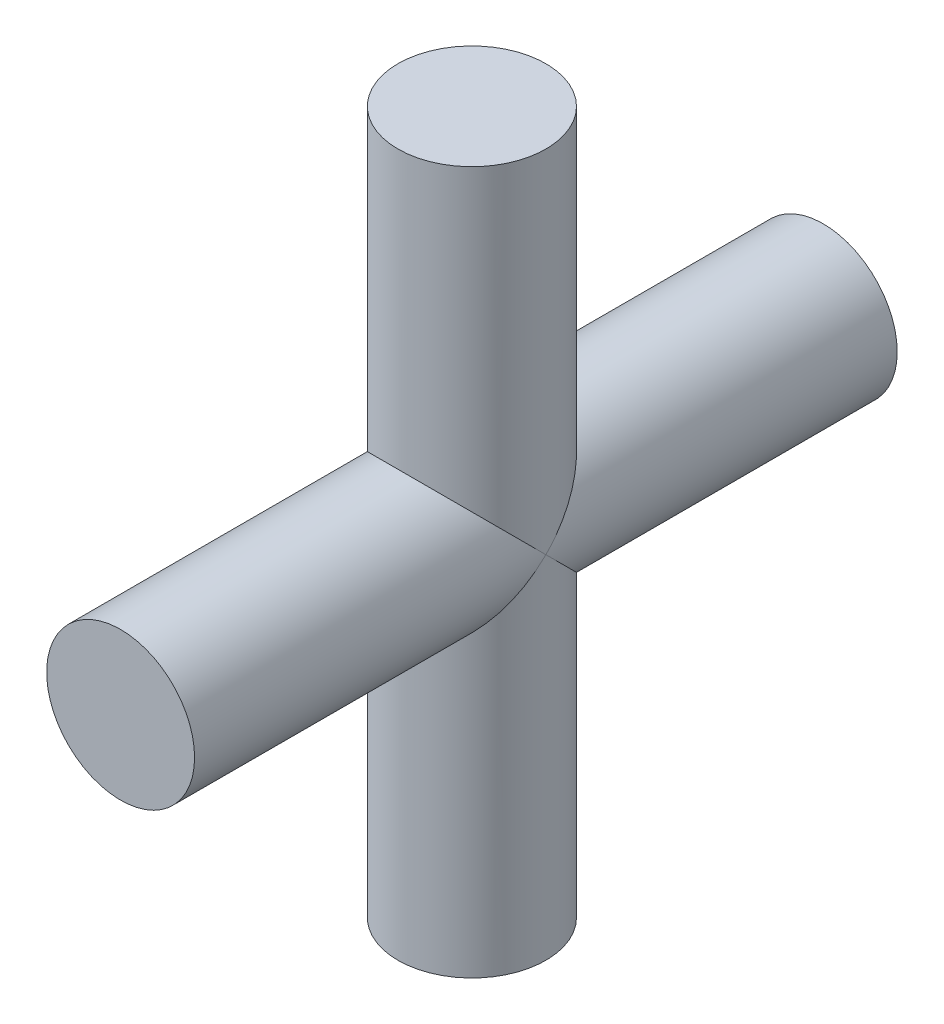
ISO-10303-21;
HEADER;
FILE_DESCRIPTION(('STEP AP214'),'2;1');
FILE_NAME('part.step','',(''),(''),'','','');
FILE_SCHEMA(('AUTOMOTIVE_DESIGN { 1 0 10303 214 1 1 1 1 }'));
ENDSEC;
DATA;
#1=APPLICATION_CONTEXT('core data for automotive mechanical design processes');
#2=APPLICATION_PROTOCOL_DEFINITION('international standard','automotive_design',2000,#1);
#3=PRODUCT_CONTEXT('',#1,'mechanical');
#4=PRODUCT('Part','Part','',(#3));
#5=PRODUCT_RELATED_PRODUCT_CATEGORY('part','',(#4));
#6=PRODUCT_DEFINITION_FORMATION('','',#4);
#7=PRODUCT_DEFINITION_CONTEXT('part definition',#1,'design');
#8=PRODUCT_DEFINITION('design','',#6,#7);
#9=PRODUCT_DEFINITION_SHAPE('','',#8);
#10=(LENGTH_UNIT() NAMED_UNIT(*) SI_UNIT(.MILLI.,.METRE.));
#11=(NAMED_UNIT(*) PLANE_ANGLE_UNIT() SI_UNIT($,.RADIAN.));
#12=(NAMED_UNIT(*) SI_UNIT($,.STERADIAN.) SOLID_ANGLE_UNIT());
#13=UNCERTAINTY_MEASURE_WITH_UNIT(LENGTH_MEASURE(1.E-05),#10,'distance_accuracy_value','');
#14=(GEOMETRIC_REPRESENTATION_CONTEXT(3) GLOBAL_UNCERTAINTY_ASSIGNED_CONTEXT((#13)) GLOBAL_UNIT_ASSIGNED_CONTEXT((#10,
#11,#12)) REPRESENTATION_CONTEXT('',''));
#15=CARTESIAN_POINT('',(0.,0.,0.));
#16=DIRECTION('',(0.,0.,1.));
#17=DIRECTION('',(1.,0.,0.));
#18=AXIS2_PLACEMENT_3D('',#15,#16,#17);
#19=CARTESIAN_POINT('',(0.,19.,0.));
#20=DIRECTION('',(0.,-1.,0.));
#21=DIRECTION('',(0.,0.,-1.));
#22=AXIS2_PLACEMENT_3D('',#19,#20,#21);
#23=CYLINDRICAL_SURFACE('',#22,2.);
#24=CARTESIAN_POINT('',(0.,9.5,0.));
#25=DIRECTION('',(0.,-0.707106781186547,-0.707106781186547));
#26=DIRECTION('',(0.,-0.707106781186547,0.707106781186547));
#27=AXIS2_PLACEMENT_3D('',#24,#25,#26);
#28=ELLIPSE('',#27,2.82842712474619,2.);
#29=CARTESIAN_POINT('',(2.,9.5,0.));
#30=VERTEX_POINT('',#29);
#31=CARTESIAN_POINT('',(-2.,9.5,0.));
#32=VERTEX_POINT('',#31);
#33=EDGE_CURVE('E58',#30,#32,#28,.T.);
#34=ORIENTED_EDGE('',*,*,#33,.T.);
#35=CARTESIAN_POINT('',(0.,9.5,0.));
#36=DIRECTION('',(0.,-0.707106781186547,0.707106781186547));
#37=DIRECTION('',(0.,-0.707106781186547,-0.707106781186547));
#38=AXIS2_PLACEMENT_3D('',#35,#36,#37);
#39=ELLIPSE('',#38,2.82842712474619,2.);
#40=EDGE_CURVE('E47',#32,#30,#39,.T.);
#41=ORIENTED_EDGE('',*,*,#40,.T.);
#42=EDGE_LOOP('',(#34,#41));
#43=FACE_BOUND('',#42,.T.);
#44=CARTESIAN_POINT('',(0.,0.,0.));
#45=DIRECTION('',(0.,1.,0.));
#46=DIRECTION('',(0.,0.,1.));
#47=AXIS2_PLACEMENT_3D('',#44,#45,#46);
#48=CIRCLE('',#47,2.);
#49=CARTESIAN_POINT('',(0.,0.,2.));
#50=VERTEX_POINT('',#49);
#51=EDGE_CURVE('E73',#50,#50,#48,.T.);
#52=ORIENTED_EDGE('',*,*,#51,.T.);
#53=EDGE_LOOP('',(#52));
#54=FACE_BOUND('',#53,.T.);
#55=ADVANCED_FACE('F39',(#43,#54),#23,.T.);
#56=CARTESIAN_POINT('',(0.,0.,0.));
#57=DIRECTION('',(0.,1.,0.));
#58=DIRECTION('',(0.,0.,1.));
#59=AXIS2_PLACEMENT_3D('',#56,#57,#58);
#60=PLANE('',#59);
#61=ORIENTED_EDGE('',*,*,#51,.F.);
#62=EDGE_LOOP('',(#61));
#63=FACE_BOUND('',#62,.T.);
#64=ADVANCED_FACE('F104',(#63),#60,.F.);
#65=CARTESIAN_POINT('',(0.,9.5,-9.5));
#66=DIRECTION('',(0.,0.,1.));
#67=DIRECTION('',(1.,0.,0.));
#68=AXIS2_PLACEMENT_3D('',#65,#66,#67);
#69=PLANE('',#68);
#70=CARTESIAN_POINT('',(0.,9.5,-9.5));
#71=DIRECTION('',(0.,0.,1.));
#72=DIRECTION('',(1.,0.,0.));
#73=AXIS2_PLACEMENT_3D('',#70,#71,#72);
#74=CIRCLE('',#73,2.);
#75=CARTESIAN_POINT('',(2.,9.5,-9.5));
#76=VERTEX_POINT('',#75);
#77=EDGE_CURVE('E77',#76,#76,#74,.T.);
#78=ORIENTED_EDGE('',*,*,#77,.F.);
#79=EDGE_LOOP('',(#78));
#80=FACE_BOUND('',#79,.T.);
#81=ADVANCED_FACE('F99',(#80),#69,.F.);
#82=CARTESIAN_POINT('',(0.,9.5,-9.5));
#83=DIRECTION('',(0.,0.,1.));
#84=DIRECTION('',(1.,0.,0.));
#85=AXIS2_PLACEMENT_3D('',#82,#83,#84);
#86=CYLINDRICAL_SURFACE('',#85,2.);
#87=ORIENTED_EDGE('',*,*,#77,.T.);
#88=EDGE_LOOP('',(#87));
#89=FACE_BOUND('',#88,.T.);
#90=ORIENTED_EDGE('',*,*,#40,.F.);
#91=CARTESIAN_POINT('',(0.,9.5,0.));
#92=DIRECTION('',(0.,-0.707106781186547,-0.707106781186547));
#93=DIRECTION('',(0.,-0.707106781186547,0.707106781186547));
#94=AXIS2_PLACEMENT_3D('',#91,#92,#93);
#95=ELLIPSE('',#94,2.82842712474619,2.);
#96=EDGE_CURVE('E52',#30,#32,#95,.F.);
#97=ORIENTED_EDGE('',*,*,#96,.F.);
#98=EDGE_LOOP('',(#90,#97));
#99=FACE_BOUND('',#98,.T.);
#100=ADVANCED_FACE('F65',(#89,#99),#86,.T.);
#101=CARTESIAN_POINT('',(0.,9.5,9.5));
#102=DIRECTION('',(0.,0.,1.));
#103=DIRECTION('',(1.,0.,0.));
#104=AXIS2_PLACEMENT_3D('',#101,#102,#103);
#105=CIRCLE('',#104,2.);
#106=CARTESIAN_POINT('',(2.,9.5,9.5));
#107=VERTEX_POINT('',#106);
#108=EDGE_CURVE('E84',#107,#107,#105,.T.);
#109=ORIENTED_EDGE('',*,*,#108,.F.);
#110=EDGE_LOOP('',(#109));
#111=FACE_BOUND('',#110,.T.);
#112=CARTESIAN_POINT('',(0.,9.5,0.));
#113=DIRECTION('',(0.,-0.707106781186547,0.707106781186547));
#114=DIRECTION('',(0.,-0.707106781186547,-0.707106781186547));
#115=AXIS2_PLACEMENT_3D('',#112,#113,#114);
#116=ELLIPSE('',#115,2.82842712474619,2.);
#117=EDGE_CURVE('E11',#32,#30,#116,.F.);
#118=ORIENTED_EDGE('',*,*,#117,.F.);
#119=ORIENTED_EDGE('',*,*,#33,.F.);
#120=EDGE_LOOP('',(#118,#119));
#121=FACE_BOUND('',#120,.T.);
#122=ADVANCED_FACE('F59',(#111,#121),#86,.T.);
#123=CARTESIAN_POINT('',(0.,9.5,9.5));
#124=DIRECTION('',(0.,0.,1.));
#125=DIRECTION('',(1.,0.,0.));
#126=AXIS2_PLACEMENT_3D('',#123,#124,#125);
#127=PLANE('',#126);
#128=ORIENTED_EDGE('',*,*,#108,.T.);
#129=EDGE_LOOP('',(#128));
#130=FACE_BOUND('',#129,.T.);
#131=ADVANCED_FACE('F89',(#130),#127,.T.);
#132=CARTESIAN_POINT('',(0.,19.,0.));
#133=DIRECTION('',(0.,1.,0.));
#134=DIRECTION('',(0.,0.,1.));
#135=AXIS2_PLACEMENT_3D('',#132,#133,#134);
#136=PLANE('',#135);
#137=CARTESIAN_POINT('',(0.,19.,0.));
#138=DIRECTION('',(0.,1.,0.));
#139=DIRECTION('',(0.,0.,1.));
#140=AXIS2_PLACEMENT_3D('',#137,#138,#139);
#141=CIRCLE('',#140,2.);
#142=CARTESIAN_POINT('',(0.,19.,2.));
#143=VERTEX_POINT('',#142);
#144=EDGE_CURVE('E67',#143,#143,#141,.T.);
#145=ORIENTED_EDGE('',*,*,#144,.T.);
#146=EDGE_LOOP('',(#145));
#147=FACE_BOUND('',#146,.T.);
#148=ADVANCED_FACE('F97',(#147),#136,.T.);
#149=ORIENTED_EDGE('',*,*,#144,.F.);
#150=EDGE_LOOP('',(#149));
#151=FACE_BOUND('',#150,.T.);
#152=ORIENTED_EDGE('',*,*,#96,.T.);
#153=ORIENTED_EDGE('',*,*,#117,.T.);
#154=EDGE_LOOP('',(#152,#153));
#155=FACE_BOUND('',#154,.T.);
#156=ADVANCED_FACE('F69',(#151,#155),#23,.T.);
#157=CLOSED_SHELL('',(#55,#64,#81,#100,#122,#131,#148,#156));
#158=MANIFOLD_SOLID_BREP('B2',#157);
#159=ADVANCED_BREP_SHAPE_REPRESENTATION('',(#18,#158),#14);
#160=SHAPE_DEFINITION_REPRESENTATION(#9,#159);
ENDSEC;
END-ISO-10303-21;
